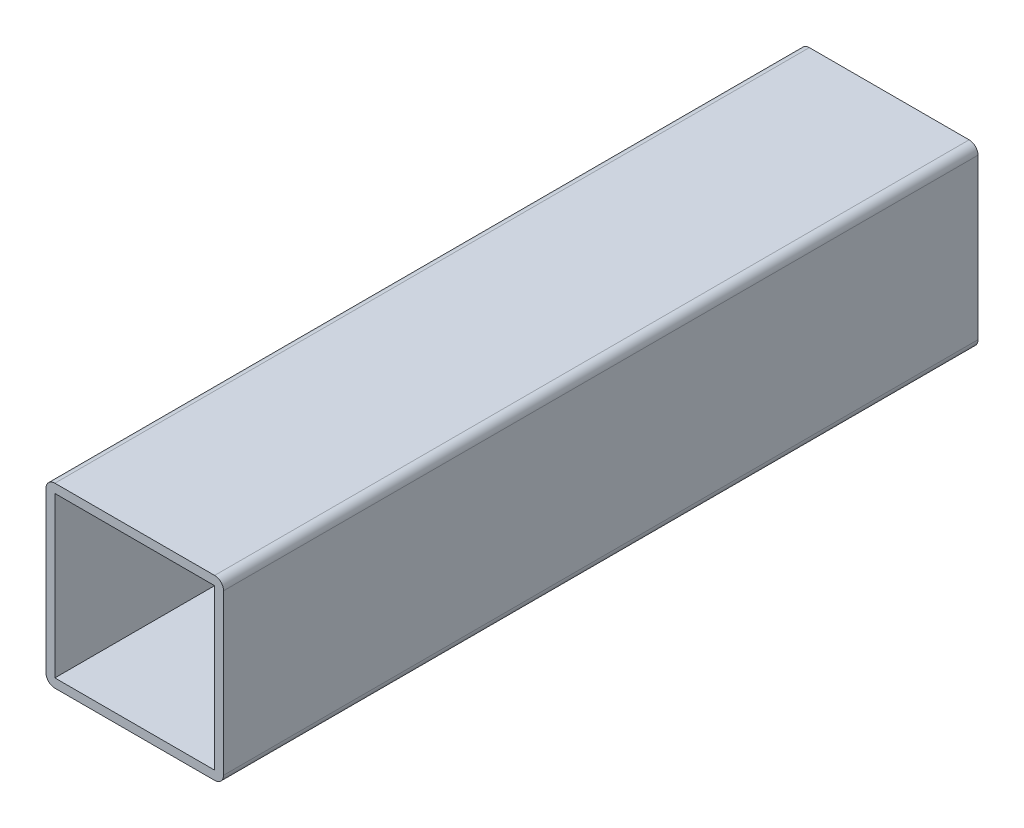
ISO-10303-21;
HEADER;
FILE_DESCRIPTION(('STEP AP214'),'2;1');
FILE_NAME('part.step','',(''),(''),'','','');
FILE_SCHEMA(('AUTOMOTIVE_DESIGN { 1 0 10303 214 1 1 1 1 }'));
ENDSEC;
DATA;
#1=APPLICATION_CONTEXT('core data for automotive mechanical design processes');
#2=APPLICATION_PROTOCOL_DEFINITION('international standard','automotive_design',2000,#1);
#3=PRODUCT_CONTEXT('',#1,'mechanical');
#4=PRODUCT('Part','Part','',(#3));
#5=PRODUCT_RELATED_PRODUCT_CATEGORY('part','',(#4));
#6=PRODUCT_DEFINITION_FORMATION('','',#4);
#7=PRODUCT_DEFINITION_CONTEXT('part definition',#1,'design');
#8=PRODUCT_DEFINITION('design','',#6,#7);
#9=PRODUCT_DEFINITION_SHAPE('','',#8);
#10=(LENGTH_UNIT() NAMED_UNIT(*) SI_UNIT(.MILLI.,.METRE.));
#11=(NAMED_UNIT(*) PLANE_ANGLE_UNIT() SI_UNIT($,.RADIAN.));
#12=(NAMED_UNIT(*) SI_UNIT($,.STERADIAN.) SOLID_ANGLE_UNIT());
#13=UNCERTAINTY_MEASURE_WITH_UNIT(LENGTH_MEASURE(1.E-05),#10,'distance_accuracy_value','');
#14=(GEOMETRIC_REPRESENTATION_CONTEXT(3) GLOBAL_UNCERTAINTY_ASSIGNED_CONTEXT((#13)) GLOBAL_UNIT_ASSIGNED_CONTEXT((#10,
#11,#12)) REPRESENTATION_CONTEXT('',''));
#15=CARTESIAN_POINT('',(0.,0.,0.));
#16=DIRECTION('',(0.,0.,1.));
#17=DIRECTION('',(1.,0.,0.));
#18=AXIS2_PLACEMENT_3D('',#15,#16,#17);
#19=CARTESIAN_POINT('',(36.,-36.,340.));
#20=DIRECTION('',(0.,0.,-1.));
#21=DIRECTION('',(-1.,0.,0.));
#22=AXIS2_PLACEMENT_3D('',#19,#20,#21);
#23=PLANE('',#22);
#24=CARTESIAN_POINT('',(36.,-36.,340.));
#25=DIRECTION('',(0.,0.,1.));
#26=DIRECTION('',(-1.,0.,0.));
#27=AXIS2_PLACEMENT_3D('',#24,#25,#26);
#28=CIRCLE('',#27,4.);
#29=CARTESIAN_POINT('',(36.,-40.,340.));
#30=VERTEX_POINT('',#29);
#31=CARTESIAN_POINT('',(40.,-36.,340.));
#32=VERTEX_POINT('',#31);
#33=EDGE_CURVE('E159',#30,#32,#28,.T.);
#34=ORIENTED_EDGE('',*,*,#33,.T.);
#35=DIRECTION('',(0.,1.,0.));
#36=VECTOR('',#35,1.);
#37=CARTESIAN_POINT('',(40.,36.,340.));
#38=LINE('',#37,#36);
#39=CARTESIAN_POINT('',(40.,36.,340.));
#40=VERTEX_POINT('',#39);
#41=EDGE_CURVE('E162',#32,#40,#38,.T.);
#42=ORIENTED_EDGE('',*,*,#41,.T.);
#43=CARTESIAN_POINT('',(36.,36.,340.));
#44=DIRECTION('',(0.,0.,1.));
#45=DIRECTION('',(-1.,0.,0.));
#46=AXIS2_PLACEMENT_3D('',#43,#44,#45);
#47=CIRCLE('',#46,4.);
#48=CARTESIAN_POINT('',(36.,40.,340.));
#49=VERTEX_POINT('',#48);
#50=EDGE_CURVE('E165',#40,#49,#47,.T.);
#51=ORIENTED_EDGE('',*,*,#50,.T.);
#52=DIRECTION('',(-1.,0.,0.));
#53=VECTOR('',#52,1.);
#54=CARTESIAN_POINT('',(-36.,40.,340.));
#55=LINE('',#54,#53);
#56=CARTESIAN_POINT('',(-36.,40.,340.));
#57=VERTEX_POINT('',#56);
#58=EDGE_CURVE('E167',#49,#57,#55,.T.);
#59=ORIENTED_EDGE('',*,*,#58,.T.);
#60=CARTESIAN_POINT('',(-36.,36.,340.));
#61=DIRECTION('',(0.,0.,1.));
#62=DIRECTION('',(1.,0.,0.));
#63=AXIS2_PLACEMENT_3D('',#60,#61,#62);
#64=CIRCLE('',#63,4.);
#65=CARTESIAN_POINT('',(-40.,36.,340.));
#66=VERTEX_POINT('',#65);
#67=EDGE_CURVE('E169',#57,#66,#64,.T.);
#68=ORIENTED_EDGE('',*,*,#67,.T.);
#69=DIRECTION('',(0.,-1.,0.));
#70=VECTOR('',#69,1.);
#71=CARTESIAN_POINT('',(-40.,36.,340.));
#72=LINE('',#71,#70);
#73=CARTESIAN_POINT('',(-40.,-36.,340.));
#74=VERTEX_POINT('',#73);
#75=EDGE_CURVE('E171',#66,#74,#72,.T.);
#76=ORIENTED_EDGE('',*,*,#75,.T.);
#77=CARTESIAN_POINT('',(-36.,-36.,340.));
#78=DIRECTION('',(0.,0.,1.));
#79=DIRECTION('',(1.,0.,0.));
#80=AXIS2_PLACEMENT_3D('',#77,#78,#79);
#81=CIRCLE('',#80,4.);
#82=CARTESIAN_POINT('',(-35.9999999999999,-40.,340.));
#83=VERTEX_POINT('',#82);
#84=EDGE_CURVE('E173',#74,#83,#81,.T.);
#85=ORIENTED_EDGE('',*,*,#84,.T.);
#86=DIRECTION('',(1.,0.,0.));
#87=VECTOR('',#86,1.);
#88=CARTESIAN_POINT('',(-35.9999999999999,-40.,340.));
#89=LINE('',#88,#87);
#90=EDGE_CURVE('E175',#83,#30,#89,.T.);
#91=ORIENTED_EDGE('',*,*,#90,.T.);
#92=EDGE_LOOP('',(#34,#42,#51,#59,#68,#76,#85,#91));
#93=FACE_BOUND('',#92,.T.);
#94=DIRECTION('',(-1.,0.,0.));
#95=VECTOR('',#94,1.);
#96=CARTESIAN_POINT('',(-36.,36.,340.));
#97=LINE('',#96,#95);
#98=CARTESIAN_POINT('',(36.,36.,340.));
#99=VERTEX_POINT('',#98);
#100=CARTESIAN_POINT('',(-36.,36.,340.));
#101=VERTEX_POINT('',#100);
#102=EDGE_CURVE('E123',#99,#101,#97,.T.);
#103=ORIENTED_EDGE('',*,*,#102,.F.);
#104=DIRECTION('',(0.,1.,0.));
#105=VECTOR('',#104,1.);
#106=CARTESIAN_POINT('',(36.,36.,340.));
#107=LINE('',#106,#105);
#108=CARTESIAN_POINT('',(36.,-36.,340.));
#109=VERTEX_POINT('',#108);
#110=EDGE_CURVE('E145',#109,#99,#107,.T.);
#111=ORIENTED_EDGE('',*,*,#110,.F.);
#112=DIRECTION('',(1.,0.,0.));
#113=VECTOR('',#112,1.);
#114=CARTESIAN_POINT('',(-36.,-36.,340.));
#115=LINE('',#114,#113);
#116=CARTESIAN_POINT('',(-36.,-36.,340.));
#117=VERTEX_POINT('',#116);
#118=EDGE_CURVE('E143',#117,#109,#115,.T.);
#119=ORIENTED_EDGE('',*,*,#118,.F.);
#120=DIRECTION('',(0.,-1.,0.));
#121=VECTOR('',#120,1.);
#122=CARTESIAN_POINT('',(-36.,36.,340.));
#123=LINE('',#122,#121);
#124=EDGE_CURVE('E131',#101,#117,#123,.T.);
#125=ORIENTED_EDGE('',*,*,#124,.F.);
#126=EDGE_LOOP('',(#103,#111,#119,#125));
#127=FACE_BOUND('',#126,.T.);
#128=ADVANCED_FACE('F34',(#93,#127),#23,.F.);
#129=CARTESIAN_POINT('',(36.,-36.,0.));
#130=DIRECTION('',(0.,0.,-1.));
#131=DIRECTION('',(-1.,0.,0.));
#132=AXIS2_PLACEMENT_3D('',#129,#130,#131);
#133=PLANE('',#132);
#134=CARTESIAN_POINT('',(36.,-36.,0.));
#135=DIRECTION('',(0.,0.,1.));
#136=DIRECTION('',(-1.,0.,0.));
#137=AXIS2_PLACEMENT_3D('',#134,#135,#136);
#138=CIRCLE('',#137,4.);
#139=CARTESIAN_POINT('',(36.,-40.,0.));
#140=VERTEX_POINT('',#139);
#141=CARTESIAN_POINT('',(40.,-36.,0.));
#142=VERTEX_POINT('',#141);
#143=EDGE_CURVE('E139',#140,#142,#138,.T.);
#144=ORIENTED_EDGE('',*,*,#143,.F.);
#145=DIRECTION('',(1.,0.,0.));
#146=VECTOR('',#145,1.);
#147=CARTESIAN_POINT('',(-35.9999999999999,-40.,0.));
#148=LINE('',#147,#146);
#149=CARTESIAN_POINT('',(-35.9999999999999,-40.,0.));
#150=VERTEX_POINT('',#149);
#151=EDGE_CURVE('E163',#150,#140,#148,.T.);
#152=ORIENTED_EDGE('',*,*,#151,.F.);
#153=CARTESIAN_POINT('',(-36.,-36.,0.));
#154=DIRECTION('',(0.,0.,1.));
#155=DIRECTION('',(1.,0.,0.));
#156=AXIS2_PLACEMENT_3D('',#153,#154,#155);
#157=CIRCLE('',#156,4.);
#158=CARTESIAN_POINT('',(-40.,-36.,0.));
#159=VERTEX_POINT('',#158);
#160=EDGE_CURVE('E190',#159,#150,#157,.T.);
#161=ORIENTED_EDGE('',*,*,#160,.F.);
#162=DIRECTION('',(0.,-1.,0.));
#163=VECTOR('',#162,1.);
#164=CARTESIAN_POINT('',(-40.,36.,0.));
#165=LINE('',#164,#163);
#166=CARTESIAN_POINT('',(-40.,36.,0.));
#167=VERTEX_POINT('',#166);
#168=EDGE_CURVE('E188',#167,#159,#165,.T.);
#169=ORIENTED_EDGE('',*,*,#168,.F.);
#170=CARTESIAN_POINT('',(-36.,36.,0.));
#171=DIRECTION('',(0.,0.,1.));
#172=DIRECTION('',(1.,0.,0.));
#173=AXIS2_PLACEMENT_3D('',#170,#171,#172);
#174=CIRCLE('',#173,4.);
#175=CARTESIAN_POINT('',(-36.,40.,0.));
#176=VERTEX_POINT('',#175);
#177=EDGE_CURVE('E186',#176,#167,#174,.T.);
#178=ORIENTED_EDGE('',*,*,#177,.F.);
#179=DIRECTION('',(-1.,0.,0.));
#180=VECTOR('',#179,1.);
#181=CARTESIAN_POINT('',(-36.,40.,0.));
#182=LINE('',#181,#180);
#183=CARTESIAN_POINT('',(36.,40.,0.));
#184=VERTEX_POINT('',#183);
#185=EDGE_CURVE('E184',#184,#176,#182,.T.);
#186=ORIENTED_EDGE('',*,*,#185,.F.);
#187=CARTESIAN_POINT('',(36.,36.,0.));
#188=DIRECTION('',(0.,0.,1.));
#189=DIRECTION('',(-1.,0.,0.));
#190=AXIS2_PLACEMENT_3D('',#187,#188,#189);
#191=CIRCLE('',#190,4.);
#192=CARTESIAN_POINT('',(40.,36.,0.));
#193=VERTEX_POINT('',#192);
#194=EDGE_CURVE('E182',#193,#184,#191,.T.);
#195=ORIENTED_EDGE('',*,*,#194,.F.);
#196=DIRECTION('',(0.,1.,0.));
#197=VECTOR('',#196,1.);
#198=CARTESIAN_POINT('',(40.,36.,0.));
#199=LINE('',#198,#197);
#200=EDGE_CURVE('E180',#142,#193,#199,.T.);
#201=ORIENTED_EDGE('',*,*,#200,.F.);
#202=EDGE_LOOP('',(#144,#152,#161,#169,#178,#186,#195,#201));
#203=FACE_BOUND('',#202,.T.);
#204=DIRECTION('',(0.,1.,0.));
#205=VECTOR('',#204,1.);
#206=CARTESIAN_POINT('',(36.,36.,0.));
#207=LINE('',#206,#205);
#208=CARTESIAN_POINT('',(36.,-36.,0.));
#209=VERTEX_POINT('',#208);
#210=CARTESIAN_POINT('',(36.,36.,0.));
#211=VERTEX_POINT('',#210);
#212=EDGE_CURVE('E132',#209,#211,#207,.T.);
#213=ORIENTED_EDGE('',*,*,#212,.T.);
#214=DIRECTION('',(-1.,0.,0.));
#215=VECTOR('',#214,1.);
#216=CARTESIAN_POINT('',(-36.,36.,0.));
#217=LINE('',#216,#215);
#218=CARTESIAN_POINT('',(-36.,36.,0.));
#219=VERTEX_POINT('',#218);
#220=EDGE_CURVE('E57',#211,#219,#217,.T.);
#221=ORIENTED_EDGE('',*,*,#220,.T.);
#222=DIRECTION('',(0.,-1.,0.));
#223=VECTOR('',#222,1.);
#224=CARTESIAN_POINT('',(-36.,36.,0.));
#225=LINE('',#224,#223);
#226=CARTESIAN_POINT('',(-36.,-36.,0.));
#227=VERTEX_POINT('',#226);
#228=EDGE_CURVE('E138',#219,#227,#225,.T.);
#229=ORIENTED_EDGE('',*,*,#228,.T.);
#230=DIRECTION('',(1.,0.,0.));
#231=VECTOR('',#230,1.);
#232=CARTESIAN_POINT('',(-36.,-36.,0.));
#233=LINE('',#232,#231);
#234=EDGE_CURVE('E151',#227,#209,#233,.T.);
#235=ORIENTED_EDGE('',*,*,#234,.T.);
#236=EDGE_LOOP('',(#213,#221,#229,#235));
#237=FACE_BOUND('',#236,.T.);
#238=ADVANCED_FACE('F220',(#203,#237),#133,.T.);
#239=CARTESIAN_POINT('',(36.,-36.,340.));
#240=DIRECTION('',(0.,0.,-1.));
#241=DIRECTION('',(-1.,0.,0.));
#242=AXIS2_PLACEMENT_3D('',#239,#240,#241);
#243=CYLINDRICAL_SURFACE('',#242,4.);
#244=ORIENTED_EDGE('',*,*,#143,.T.);
#245=DIRECTION('',(0.,0.,-1.));
#246=VECTOR('',#245,1.);
#247=CARTESIAN_POINT('',(40.,-36.,340.));
#248=LINE('',#247,#246);
#249=EDGE_CURVE('E11',#32,#142,#248,.T.);
#250=ORIENTED_EDGE('',*,*,#249,.F.);
#251=ORIENTED_EDGE('',*,*,#33,.F.);
#252=DIRECTION('',(0.,0.,-1.));
#253=VECTOR('',#252,1.);
#254=CARTESIAN_POINT('',(36.,-40.,340.));
#255=LINE('',#254,#253);
#256=EDGE_CURVE('E177',#30,#140,#255,.T.);
#257=ORIENTED_EDGE('',*,*,#256,.T.);
#258=EDGE_LOOP('',(#244,#250,#251,#257));
#259=FACE_BOUND('',#258,.T.);
#260=ADVANCED_FACE('F36',(#259),#243,.T.);
#261=CARTESIAN_POINT('',(40.,36.,340.));
#262=DIRECTION('',(-1.,0.,0.));
#263=DIRECTION('',(0.,0.,1.));
#264=AXIS2_PLACEMENT_3D('',#261,#262,#263);
#265=PLANE('',#264);
#266=ORIENTED_EDGE('',*,*,#200,.T.);
#267=DIRECTION('',(0.,0.,-1.));
#268=VECTOR('',#267,1.);
#269=CARTESIAN_POINT('',(40.,36.,340.));
#270=LINE('',#269,#268);
#271=EDGE_CURVE('E42',#40,#193,#270,.T.);
#272=ORIENTED_EDGE('',*,*,#271,.F.);
#273=ORIENTED_EDGE('',*,*,#41,.F.);
#274=ORIENTED_EDGE('',*,*,#249,.T.);
#275=EDGE_LOOP('',(#266,#272,#273,#274));
#276=FACE_BOUND('',#275,.T.);
#277=ADVANCED_FACE('F237',(#276),#265,.F.);
#278=CARTESIAN_POINT('',(36.,36.,340.));
#279=DIRECTION('',(0.,0.,-1.));
#280=DIRECTION('',(-1.,0.,0.));
#281=AXIS2_PLACEMENT_3D('',#278,#279,#280);
#282=CYLINDRICAL_SURFACE('',#281,4.);
#283=ORIENTED_EDGE('',*,*,#194,.T.);
#284=DIRECTION('',(0.,0.,-1.));
#285=VECTOR('',#284,1.);
#286=CARTESIAN_POINT('',(36.,40.,340.));
#287=LINE('',#286,#285);
#288=EDGE_CURVE('E207',#49,#184,#287,.T.);
#289=ORIENTED_EDGE('',*,*,#288,.F.);
#290=ORIENTED_EDGE('',*,*,#50,.F.);
#291=ORIENTED_EDGE('',*,*,#271,.T.);
#292=EDGE_LOOP('',(#283,#289,#290,#291));
#293=FACE_BOUND('',#292,.T.);
#294=ADVANCED_FACE('F214',(#293),#282,.T.);
#295=CARTESIAN_POINT('',(-36.,40.,340.));
#296=DIRECTION('',(0.,-1.,0.));
#297=DIRECTION('',(0.,0.,-1.));
#298=AXIS2_PLACEMENT_3D('',#295,#296,#297);
#299=PLANE('',#298);
#300=ORIENTED_EDGE('',*,*,#185,.T.);
#301=DIRECTION('',(0.,0.,-1.));
#302=VECTOR('',#301,1.);
#303=CARTESIAN_POINT('',(-36.,40.,340.));
#304=LINE('',#303,#302);
#305=EDGE_CURVE('E204',#57,#176,#304,.T.);
#306=ORIENTED_EDGE('',*,*,#305,.F.);
#307=ORIENTED_EDGE('',*,*,#58,.F.);
#308=ORIENTED_EDGE('',*,*,#288,.T.);
#309=EDGE_LOOP('',(#300,#306,#307,#308));
#310=FACE_BOUND('',#309,.T.);
#311=ADVANCED_FACE('F226',(#310),#299,.F.);
#312=CARTESIAN_POINT('',(-36.,36.,340.));
#313=DIRECTION('',(0.,0.,-1.));
#314=DIRECTION('',(-1.,0.,0.));
#315=AXIS2_PLACEMENT_3D('',#312,#313,#314);
#316=CYLINDRICAL_SURFACE('',#315,4.);
#317=ORIENTED_EDGE('',*,*,#177,.T.);
#318=DIRECTION('',(0.,0.,-1.));
#319=VECTOR('',#318,1.);
#320=CARTESIAN_POINT('',(-40.,36.,340.));
#321=LINE('',#320,#319);
#322=EDGE_CURVE('E201',#66,#167,#321,.T.);
#323=ORIENTED_EDGE('',*,*,#322,.F.);
#324=ORIENTED_EDGE('',*,*,#67,.F.);
#325=ORIENTED_EDGE('',*,*,#305,.T.);
#326=EDGE_LOOP('',(#317,#323,#324,#325));
#327=FACE_BOUND('',#326,.T.);
#328=ADVANCED_FACE('F230',(#327),#316,.T.);
#329=CARTESIAN_POINT('',(-40.,36.,340.));
#330=DIRECTION('',(1.,0.,0.));
#331=DIRECTION('',(0.,1.,0.));
#332=AXIS2_PLACEMENT_3D('',#329,#330,#331);
#333=PLANE('',#332);
#334=ORIENTED_EDGE('',*,*,#168,.T.);
#335=DIRECTION('',(0.,0.,-1.));
#336=VECTOR('',#335,1.);
#337=CARTESIAN_POINT('',(-40.,-36.,340.));
#338=LINE('',#337,#336);
#339=EDGE_CURVE('E198',#74,#159,#338,.T.);
#340=ORIENTED_EDGE('',*,*,#339,.F.);
#341=ORIENTED_EDGE('',*,*,#75,.F.);
#342=ORIENTED_EDGE('',*,*,#322,.T.);
#343=EDGE_LOOP('',(#334,#340,#341,#342));
#344=FACE_BOUND('',#343,.T.);
#345=ADVANCED_FACE('F250',(#344),#333,.F.);
#346=CARTESIAN_POINT('',(-36.,-36.,340.));
#347=DIRECTION('',(0.,0.,-1.));
#348=DIRECTION('',(-1.,0.,0.));
#349=AXIS2_PLACEMENT_3D('',#346,#347,#348);
#350=CYLINDRICAL_SURFACE('',#349,4.);
#351=ORIENTED_EDGE('',*,*,#160,.T.);
#352=DIRECTION('',(0.,0.,-1.));
#353=VECTOR('',#352,1.);
#354=CARTESIAN_POINT('',(-35.9999999999999,-40.,340.));
#355=LINE('',#354,#353);
#356=EDGE_CURVE('E195',#83,#150,#355,.T.);
#357=ORIENTED_EDGE('',*,*,#356,.F.);
#358=ORIENTED_EDGE('',*,*,#84,.F.);
#359=ORIENTED_EDGE('',*,*,#339,.T.);
#360=EDGE_LOOP('',(#351,#357,#358,#359));
#361=FACE_BOUND('',#360,.T.);
#362=ADVANCED_FACE('F248',(#361),#350,.T.);
#363=CARTESIAN_POINT('',(-35.9999999999999,-40.,340.));
#364=DIRECTION('',(0.,1.,0.));
#365=DIRECTION('',(0.,0.,1.));
#366=AXIS2_PLACEMENT_3D('',#363,#364,#365);
#367=PLANE('',#366);
#368=ORIENTED_EDGE('',*,*,#151,.T.);
#369=ORIENTED_EDGE('',*,*,#256,.F.);
#370=ORIENTED_EDGE('',*,*,#90,.F.);
#371=ORIENTED_EDGE('',*,*,#356,.T.);
#372=EDGE_LOOP('',(#368,#369,#370,#371));
#373=FACE_BOUND('',#372,.T.);
#374=ADVANCED_FACE('F243',(#373),#367,.F.);
#375=CARTESIAN_POINT('',(-36.,36.,340.));
#376=DIRECTION('',(0.,-1.,0.));
#377=DIRECTION('',(1.,0.,0.));
#378=AXIS2_PLACEMENT_3D('',#375,#376,#377);
#379=PLANE('',#378);
#380=ORIENTED_EDGE('',*,*,#220,.F.);
#381=DIRECTION('',(0.,0.,-1.));
#382=VECTOR('',#381,1.);
#383=CARTESIAN_POINT('',(36.,36.,340.));
#384=LINE('',#383,#382);
#385=EDGE_CURVE('E127',#99,#211,#384,.T.);
#386=ORIENTED_EDGE('',*,*,#385,.F.);
#387=ORIENTED_EDGE('',*,*,#102,.T.);
#388=DIRECTION('',(0.,0.,-1.));
#389=VECTOR('',#388,1.);
#390=CARTESIAN_POINT('',(-36.,36.,340.));
#391=LINE('',#390,#389);
#392=EDGE_CURVE('E126',#101,#219,#391,.T.);
#393=ORIENTED_EDGE('',*,*,#392,.T.);
#394=EDGE_LOOP('',(#380,#386,#387,#393));
#395=FACE_BOUND('',#394,.T.);
#396=ADVANCED_FACE('F125',(#395),#379,.T.);
#397=CARTESIAN_POINT('',(-36.,36.,340.));
#398=DIRECTION('',(1.,0.,0.));
#399=DIRECTION('',(0.,0.,-1.));
#400=AXIS2_PLACEMENT_3D('',#397,#398,#399);
#401=PLANE('',#400);
#402=ORIENTED_EDGE('',*,*,#228,.F.);
#403=ORIENTED_EDGE('',*,*,#392,.F.);
#404=ORIENTED_EDGE('',*,*,#124,.T.);
#405=DIRECTION('',(0.,0.,-1.));
#406=VECTOR('',#405,1.);
#407=CARTESIAN_POINT('',(-36.,-36.,340.));
#408=LINE('',#407,#406);
#409=EDGE_CURVE('E140',#117,#227,#408,.T.);
#410=ORIENTED_EDGE('',*,*,#409,.T.);
#411=EDGE_LOOP('',(#402,#403,#404,#410));
#412=FACE_BOUND('',#411,.T.);
#413=ADVANCED_FACE('F135',(#412),#401,.T.);
#414=CARTESIAN_POINT('',(-36.,-36.,340.));
#415=DIRECTION('',(0.,1.,0.));
#416=DIRECTION('',(-1.,0.,0.));
#417=AXIS2_PLACEMENT_3D('',#414,#415,#416);
#418=PLANE('',#417);
#419=ORIENTED_EDGE('',*,*,#234,.F.);
#420=ORIENTED_EDGE('',*,*,#409,.F.);
#421=ORIENTED_EDGE('',*,*,#118,.T.);
#422=DIRECTION('',(0.,0.,-1.));
#423=VECTOR('',#422,1.);
#424=CARTESIAN_POINT('',(36.,-36.,340.));
#425=LINE('',#424,#423);
#426=EDGE_CURVE('E49',#109,#209,#425,.T.);
#427=ORIENTED_EDGE('',*,*,#426,.T.);
#428=EDGE_LOOP('',(#419,#420,#421,#427));
#429=FACE_BOUND('',#428,.T.);
#430=ADVANCED_FACE('F275',(#429),#418,.T.);
#431=CARTESIAN_POINT('',(36.,36.,340.));
#432=DIRECTION('',(-1.,0.,0.));
#433=DIRECTION('',(0.,-1.,0.));
#434=AXIS2_PLACEMENT_3D('',#431,#432,#433);
#435=PLANE('',#434);
#436=ORIENTED_EDGE('',*,*,#212,.F.);
#437=ORIENTED_EDGE('',*,*,#426,.F.);
#438=ORIENTED_EDGE('',*,*,#110,.T.);
#439=ORIENTED_EDGE('',*,*,#385,.T.);
#440=EDGE_LOOP('',(#436,#437,#438,#439));
#441=FACE_BOUND('',#440,.T.);
#442=ADVANCED_FACE('F279',(#441),#435,.T.);
#443=CLOSED_SHELL('',(#128,#238,#260,#277,#294,#311,#328,#345,#362,#374,#396,#413,#430,#442));
#444=MANIFOLD_SOLID_BREP('B2',#443);
#445=ADVANCED_BREP_SHAPE_REPRESENTATION('',(#18,#444),#14);
#446=SHAPE_DEFINITION_REPRESENTATION(#9,#445);
ENDSEC;
END-ISO-10303-21;
